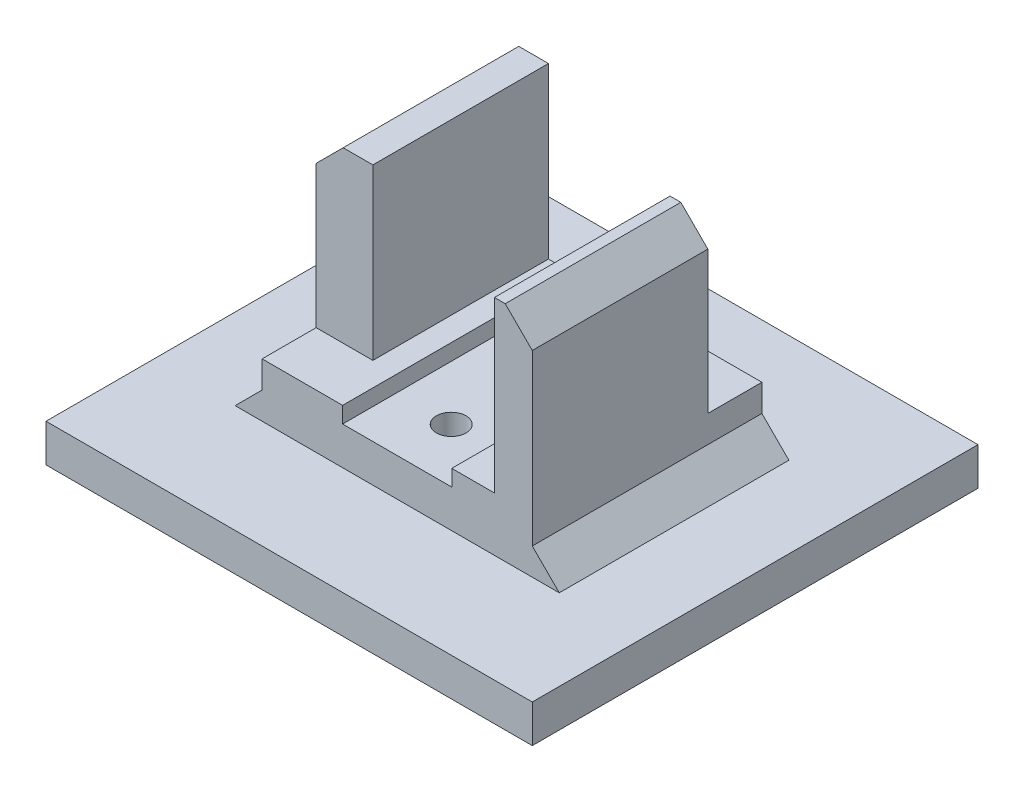
ISO-10303-21;
HEADER;
FILE_DESCRIPTION(('STEP AP214'),'2;1');
FILE_NAME('part.step','',(''),(''),'','','');
FILE_SCHEMA(('AUTOMOTIVE_DESIGN { 1 0 10303 214 1 1 1 1 }'));
ENDSEC;
DATA;
#1=APPLICATION_CONTEXT('core data for automotive mechanical design processes');
#2=APPLICATION_PROTOCOL_DEFINITION('international standard','automotive_design',2000,#1);
#3=PRODUCT_CONTEXT('',#1,'mechanical');
#4=PRODUCT('Part','Part','',(#3));
#5=PRODUCT_RELATED_PRODUCT_CATEGORY('part','',(#4));
#6=PRODUCT_DEFINITION_FORMATION('','',#4);
#7=PRODUCT_DEFINITION_CONTEXT('part definition',#1,'design');
#8=PRODUCT_DEFINITION('design','',#6,#7);
#9=PRODUCT_DEFINITION_SHAPE('','',#8);
#10=(LENGTH_UNIT() NAMED_UNIT(*) SI_UNIT(.MILLI.,.METRE.));
#11=(NAMED_UNIT(*) PLANE_ANGLE_UNIT() SI_UNIT($,.RADIAN.));
#12=(NAMED_UNIT(*) SI_UNIT($,.STERADIAN.) SOLID_ANGLE_UNIT());
#13=UNCERTAINTY_MEASURE_WITH_UNIT(LENGTH_MEASURE(1.E-05),#10,'distance_accuracy_value','');
#14=(GEOMETRIC_REPRESENTATION_CONTEXT(3) GLOBAL_UNCERTAINTY_ASSIGNED_CONTEXT((#13)) GLOBAL_UNIT_ASSIGNED_CONTEXT((#10,
#11,#12)) REPRESENTATION_CONTEXT('',''));
#15=CARTESIAN_POINT('',(0.,0.,0.));
#16=DIRECTION('',(0.,0.,1.));
#17=DIRECTION('',(1.,0.,0.));
#18=AXIS2_PLACEMENT_3D('',#15,#16,#17);
#19=CARTESIAN_POINT('',(50.,-19.2478049012123,25.574084419921));
#20=DIRECTION('',(0.,-1.,0.));
#21=DIRECTION('',(0.,0.,-1.));
#22=AXIS2_PLACEMENT_3D('',#19,#20,#21);
#23=PLANE('',#22);
#24=CARTESIAN_POINT('',(25.,-19.2478049012123,36.074084419921));
#25=DIRECTION('',(0.,1.,0.));
#26=DIRECTION('',(0.,0.,1.));
#27=AXIS2_PLACEMENT_3D('',#24,#25,#26);
#28=CIRCLE('',#27,2.75);
#29=CARTESIAN_POINT('',(25.,-19.2478049012123,38.824084419921));
#30=VERTEX_POINT('',#29);
#31=EDGE_CURVE('E353',#30,#30,#28,.T.);
#32=ORIENTED_EDGE('',*,*,#31,.F.);
#33=EDGE_LOOP('',(#32));
#34=FACE_BOUND('',#33,.T.);
#35=CARTESIAN_POINT('',(25.,-19.2478049012123,58.074084419921));
#36=DIRECTION('',(0.,1.,0.));
#37=DIRECTION('',(0.,0.,1.));
#38=AXIS2_PLACEMENT_3D('',#35,#36,#37);
#39=CIRCLE('',#38,2.75);
#40=CARTESIAN_POINT('',(25.,-19.2478049012123,60.824084419921));
#41=VERTEX_POINT('',#40);
#42=EDGE_CURVE('E348',#41,#41,#39,.T.);
#43=ORIENTED_EDGE('',*,*,#42,.F.);
#44=EDGE_LOOP('',(#43));
#45=FACE_BOUND('',#44,.T.);
#46=DIRECTION('',(0.,0.,-1.));
#47=VECTOR('',#46,1.);
#48=CARTESIAN_POINT('',(14.9,-19.2478049012123,68.074084419921));
#49=LINE('',#48,#47);
#50=CARTESIAN_POINT('',(14.9,-19.2478049012123,68.074084419921));
#51=VERTEX_POINT('',#50);
#52=CARTESIAN_POINT('',(14.9,-19.2478049012123,25.574084419921));
#53=VERTEX_POINT('',#52);
#54=EDGE_CURVE('E312',#51,#53,#49,.T.);
#55=ORIENTED_EDGE('',*,*,#54,.F.);
#56=DIRECTION('',(-1.,0.,0.));
#57=VECTOR('',#56,1.);
#58=CARTESIAN_POINT('',(50.,-19.2478049012123,68.074084419921));
#59=LINE('',#58,#57);
#60=CARTESIAN_POINT('',(35.1,-19.2478049012123,68.074084419921));
#61=VERTEX_POINT('',#60);
#62=EDGE_CURVE('E244',#61,#51,#59,.T.);
#63=ORIENTED_EDGE('',*,*,#62,.F.);
#64=DIRECTION('',(0.,0.,1.));
#65=VECTOR('',#64,1.);
#66=CARTESIAN_POINT('',(35.1,-19.2478049012123,68.074084419921));
#67=LINE('',#66,#65);
#68=CARTESIAN_POINT('',(35.1,-19.2478049012123,25.574084419921));
#69=VERTEX_POINT('',#68);
#70=EDGE_CURVE('E330',#69,#61,#67,.T.);
#71=ORIENTED_EDGE('',*,*,#70,.F.);
#72=DIRECTION('',(-1.,0.,0.));
#73=VECTOR('',#72,1.);
#74=CARTESIAN_POINT('',(50.,-19.2478049012123,25.574084419921));
#75=LINE('',#74,#73);
#76=EDGE_CURVE('E249',#69,#53,#75,.T.);
#77=ORIENTED_EDGE('',*,*,#76,.T.);
#78=EDGE_LOOP('',(#55,#63,#71,#77));
#79=FACE_BOUND('',#78,.T.);
#80=ADVANCED_FACE('F32',(#34,#45,#79),#23,.F.);
#81=CARTESIAN_POINT('',(10.5,-19.2478049012123,-10.3365153371065));
#82=DIRECTION('',(1.,0.,0.));
#83=DIRECTION('',(0.,1.,0.));
#84=AXIS2_PLACEMENT_3D('',#81,#82,#83);
#85=PLANE('',#84);
#86=DIRECTION('',(0.,1.,0.));
#87=VECTOR('',#86,1.);
#88=CARTESIAN_POINT('',(10.5,-27.6605171117256,58.074084419921));
#89=LINE('',#88,#87);
#90=CARTESIAN_POINT('',(10.5,-16.2478049012123,58.074084419921));
#91=VERTEX_POINT('',#90);
#92=CARTESIAN_POINT('',(10.5,15.0934410707879,58.074084419921));
#93=VERTEX_POINT('',#92);
#94=EDGE_CURVE('E309',#91,#93,#89,.T.);
#95=ORIENTED_EDGE('',*,*,#94,.F.);
#96=DIRECTION('',(0.,0.,1.));
#97=VECTOR('',#96,1.);
#98=CARTESIAN_POINT('',(10.5,-16.2478049012123,68.074084419921));
#99=LINE('',#98,#97);
#100=CARTESIAN_POINT('',(10.5,-16.2478049012123,25.574084419921));
#101=VERTEX_POINT('',#100);
#102=EDGE_CURVE('E308',#101,#91,#99,.T.);
#103=ORIENTED_EDGE('',*,*,#102,.F.);
#104=DIRECTION('',(0.,-1.,0.));
#105=VECTOR('',#104,1.);
#106=CARTESIAN_POINT('',(10.5,-19.2478049012123,25.574084419921));
#107=LINE('',#106,#105);
#108=CARTESIAN_POINT('',(10.5,15.0934410707879,25.574084419921));
#109=VERTEX_POINT('',#108);
#110=EDGE_CURVE('E205',#109,#101,#107,.T.);
#111=ORIENTED_EDGE('',*,*,#110,.F.);
#112=DIRECTION('',(0.,0.,1.));
#113=VECTOR('',#112,1.);
#114=CARTESIAN_POINT('',(10.5,15.0934410707879,-10.3365153371065));
#115=LINE('',#114,#113);
#116=EDGE_CURVE('E202',#109,#93,#115,.T.);
#117=ORIENTED_EDGE('',*,*,#116,.T.);
#118=EDGE_LOOP('',(#95,#103,#111,#117));
#119=FACE_BOUND('',#118,.T.);
#120=ADVANCED_FACE('F306',(#119),#85,.T.);
#121=CARTESIAN_POINT('',(50.,-19.2478049012123,25.574084419921));
#122=DIRECTION('',(0.,0.,1.));
#123=DIRECTION('',(1.,0.,0.));
#124=AXIS2_PLACEMENT_3D('',#121,#122,#123);
#125=PLANE('',#124);
#126=DIRECTION('',(-1.,0.,0.));
#127=VECTOR('',#126,1.);
#128=CARTESIAN_POINT('',(43.,-16.2478049012123,25.574084419921));
#129=LINE('',#128,#127);
#130=CARTESIAN_POINT('',(50.,-16.2478049012123,25.574084419921));
#131=VERTEX_POINT('',#130);
#132=CARTESIAN_POINT('',(35.1,-16.2478049012123,25.574084419921));
#133=VERTEX_POINT('',#132);
#134=EDGE_CURVE('E333',#131,#133,#129,.T.);
#135=ORIENTED_EDGE('',*,*,#134,.F.);
#136=DIRECTION('',(0.,1.,0.));
#137=VECTOR('',#136,1.);
#138=CARTESIAN_POINT('',(50.,-19.2478049012123,25.574084419921));
#139=LINE('',#138,#137);
#140=CARTESIAN_POINT('',(50.,-21.2478049012123,25.574084419921));
#141=VERTEX_POINT('',#140);
#142=EDGE_CURVE('E238',#141,#131,#139,.T.);
#143=ORIENTED_EDGE('',*,*,#142,.F.);
#144=DIRECTION('',(-0.707106781186552,0.707106781186543,0.));
#145=VECTOR('',#144,1.);
#146=CARTESIAN_POINT('',(49.,-20.2478049012123,25.574084419921));
#147=LINE('',#146,#145);
#148=CARTESIAN_POINT('',(55.0000000000001,-26.2478049012123,25.574084419921));
#149=VERTEX_POINT('',#148);
#150=EDGE_CURVE('E271',#141,#149,#147,.F.);
#151=ORIENTED_EDGE('',*,*,#150,.T.);
#152=DIRECTION('',(1.,0.,0.));
#153=VECTOR('',#152,1.);
#154=CARTESIAN_POINT('',(50.,-26.2478049012123,25.574084419921));
#155=LINE('',#154,#153);
#156=CARTESIAN_POINT('',(-5.00000000000003,-26.2478049012123,25.574084419921));
#157=VERTEX_POINT('',#156);
#158=EDGE_CURVE('E225',#157,#149,#155,.T.);
#159=ORIENTED_EDGE('',*,*,#158,.F.);
#160=DIRECTION('',(0.707106781186551,0.707106781186544,0.));
#161=VECTOR('',#160,1.);
#162=CARTESIAN_POINT('',(26.0000000000003,4.75219509878769,25.574084419921));
#163=LINE('',#162,#161);
#164=CARTESIAN_POINT('',(0.,-21.2478049012123,25.574084419921));
#165=VERTEX_POINT('',#164);
#166=EDGE_CURVE('E263',#157,#165,#163,.T.);
#167=ORIENTED_EDGE('',*,*,#166,.T.);
#168=DIRECTION('',(0.,1.,0.));
#169=VECTOR('',#168,1.);
#170=CARTESIAN_POINT('',(0.,-19.2478049012123,25.574084419921));
#171=LINE('',#170,#169);
#172=CARTESIAN_POINT('',(0.,10.0934410707879,25.574084419921));
#173=VERTEX_POINT('',#172);
#174=EDGE_CURVE('E237',#165,#173,#171,.T.);
#175=ORIENTED_EDGE('',*,*,#174,.T.);
#176=DIRECTION('',(-0.707106781186547,-0.707106781186549,0.));
#177=VECTOR('',#176,1.);
#178=CARTESIAN_POINT('',(4.99999999999999,15.0934410707879,25.574084419921));
#179=LINE('',#178,#177);
#180=CARTESIAN_POINT('',(4.99999999999999,15.0934410707879,25.574084419921));
#181=VERTEX_POINT('',#180);
#182=EDGE_CURVE('E54',#173,#181,#179,.F.);
#183=ORIENTED_EDGE('',*,*,#182,.T.);
#184=DIRECTION('',(1.,0.,0.));
#185=VECTOR('',#184,1.);
#186=CARTESIAN_POINT('',(10.5,15.0934410707879,25.574084419921));
#187=LINE('',#186,#185);
#188=EDGE_CURVE('E212',#181,#109,#187,.T.);
#189=ORIENTED_EDGE('',*,*,#188,.T.);
#190=ORIENTED_EDGE('',*,*,#110,.T.);
#191=DIRECTION('',(-1.,0.,0.));
#192=VECTOR('',#191,1.);
#193=CARTESIAN_POINT('',(10.5,-16.2478049012123,25.574084419921));
#194=LINE('',#193,#192);
#195=CARTESIAN_POINT('',(14.9,-16.2478049012123,25.574084419921));
#196=VERTEX_POINT('',#195);
#197=EDGE_CURVE('E323',#196,#101,#194,.T.);
#198=ORIENTED_EDGE('',*,*,#197,.F.);
#199=DIRECTION('',(0.,-1.,0.));
#200=VECTOR('',#199,1.);
#201=CARTESIAN_POINT('',(14.9,-16.2478049012123,25.574084419921));
#202=LINE('',#201,#200);
#203=EDGE_CURVE('E324',#196,#53,#202,.T.);
#204=ORIENTED_EDGE('',*,*,#203,.T.);
#205=ORIENTED_EDGE('',*,*,#76,.F.);
#206=DIRECTION('',(0.,-1.,0.));
#207=VECTOR('',#206,1.);
#208=CARTESIAN_POINT('',(35.1,-16.2478049012123,25.574084419921));
#209=LINE('',#208,#207);
#210=EDGE_CURVE('E345',#133,#69,#209,.T.);
#211=ORIENTED_EDGE('',*,*,#210,.F.);
#212=EDGE_LOOP('',(#135,#143,#151,#159,#167,#175,#183,#189,#190,#198,#204,#205,#211));
#213=FACE_BOUND('',#212,.T.);
#214=ADVANCED_FACE('F292',(#213),#125,.F.);
#215=CARTESIAN_POINT('',(50.,-19.2478049012123,68.074084419921));
#216=DIRECTION('',(0.,0.,-1.));
#217=DIRECTION('',(-1.,0.,0.));
#218=AXIS2_PLACEMENT_3D('',#215,#216,#217);
#219=PLANE('',#218);
#220=DIRECTION('',(1.,0.,0.));
#221=VECTOR('',#220,1.);
#222=CARTESIAN_POINT('',(10.5,-16.2478049012123,68.074084419921));
#223=LINE('',#222,#221);
#224=CARTESIAN_POINT('',(0.,-16.2478049012123,68.074084419921));
#225=VERTEX_POINT('',#224);
#226=CARTESIAN_POINT('',(14.9,-16.2478049012123,68.074084419921));
#227=VERTEX_POINT('',#226);
#228=EDGE_CURVE('E311',#225,#227,#223,.T.);
#229=ORIENTED_EDGE('',*,*,#228,.F.);
#230=DIRECTION('',(0.,-1.,0.));
#231=VECTOR('',#230,1.);
#232=CARTESIAN_POINT('',(0.,-19.2478049012123,68.074084419921));
#233=LINE('',#232,#231);
#234=CARTESIAN_POINT('',(0.,-21.2478049012123,68.074084419921));
#235=VERTEX_POINT('',#234);
#236=EDGE_CURVE('E242',#225,#235,#233,.T.);
#237=ORIENTED_EDGE('',*,*,#236,.T.);
#238=DIRECTION('',(-0.707106781186551,-0.707106781186544,0.));
#239=VECTOR('',#238,1.);
#240=CARTESIAN_POINT('',(26.0000000000003,4.75219509878769,68.074084419921));
#241=LINE('',#240,#239);
#242=CARTESIAN_POINT('',(-5.00000000000003,-26.2478049012123,68.074084419921));
#243=VERTEX_POINT('',#242);
#244=EDGE_CURVE('E265',#235,#243,#241,.T.);
#245=ORIENTED_EDGE('',*,*,#244,.T.);
#246=DIRECTION('',(-1.,0.,0.));
#247=VECTOR('',#246,1.);
#248=CARTESIAN_POINT('',(50.,-26.2478049012123,68.074084419921));
#249=LINE('',#248,#247);
#250=CARTESIAN_POINT('',(55.0000000000001,-26.2478049012123,68.074084419921));
#251=VERTEX_POINT('',#250);
#252=EDGE_CURVE('E223',#251,#243,#249,.T.);
#253=ORIENTED_EDGE('',*,*,#252,.F.);
#254=DIRECTION('',(0.707106781186552,-0.707106781186543,0.));
#255=VECTOR('',#254,1.);
#256=CARTESIAN_POINT('',(49.,-20.2478049012123,68.074084419921));
#257=LINE('',#256,#255);
#258=CARTESIAN_POINT('',(50.,-21.2478049012123,68.074084419921));
#259=VERTEX_POINT('',#258);
#260=EDGE_CURVE('E268',#251,#259,#257,.F.);
#261=ORIENTED_EDGE('',*,*,#260,.T.);
#262=DIRECTION('',(0.,-1.,0.));
#263=VECTOR('',#262,1.);
#264=CARTESIAN_POINT('',(50.,-19.2478049012123,68.074084419921));
#265=LINE('',#264,#263);
#266=CARTESIAN_POINT('',(50.,10.0934410707879,68.074084419921));
#267=VERTEX_POINT('',#266);
#268=EDGE_CURVE('E241',#267,#259,#265,.T.);
#269=ORIENTED_EDGE('',*,*,#268,.F.);
#270=DIRECTION('',(-0.707106781186549,0.707106781186547,0.));
#271=VECTOR('',#270,1.);
#272=CARTESIAN_POINT('',(50.,10.0934410707879,68.074084419921));
#273=LINE('',#272,#271);
#274=CARTESIAN_POINT('',(45.,15.0934410707879,68.074084419921));
#275=VERTEX_POINT('',#274);
#276=EDGE_CURVE('E276',#267,#275,#273,.T.);
#277=ORIENTED_EDGE('',*,*,#276,.T.);
#278=DIRECTION('',(-1.,0.,0.));
#279=VECTOR('',#278,1.);
#280=CARTESIAN_POINT('',(50.,15.0934410707879,68.074084419921));
#281=LINE('',#280,#279);
#282=CARTESIAN_POINT('',(43.,15.0934410707879,68.074084419921));
#283=VERTEX_POINT('',#282);
#284=EDGE_CURVE('E207',#275,#283,#281,.T.);
#285=ORIENTED_EDGE('',*,*,#284,.T.);
#286=DIRECTION('',(0.,-1.,0.));
#287=VECTOR('',#286,1.);
#288=CARTESIAN_POINT('',(43.,-19.2478049012123,68.074084419921));
#289=LINE('',#288,#287);
#290=CARTESIAN_POINT('',(43.,-16.2478049012123,68.074084419921));
#291=VERTEX_POINT('',#290);
#292=EDGE_CURVE('E201',#283,#291,#289,.T.);
#293=ORIENTED_EDGE('',*,*,#292,.T.);
#294=DIRECTION('',(1.,0.,0.));
#295=VECTOR('',#294,1.);
#296=CARTESIAN_POINT('',(43.,-16.2478049012123,68.074084419921));
#297=LINE('',#296,#295);
#298=CARTESIAN_POINT('',(35.1,-16.2478049012123,68.074084419921));
#299=VERTEX_POINT('',#298);
#300=EDGE_CURVE('E337',#299,#291,#297,.T.);
#301=ORIENTED_EDGE('',*,*,#300,.F.);
#302=DIRECTION('',(0.,-1.,0.));
#303=VECTOR('',#302,1.);
#304=CARTESIAN_POINT('',(35.1,-16.2478049012123,68.074084419921));
#305=LINE('',#304,#303);
#306=EDGE_CURVE('E340',#299,#61,#305,.T.);
#307=ORIENTED_EDGE('',*,*,#306,.T.);
#308=ORIENTED_EDGE('',*,*,#62,.T.);
#309=DIRECTION('',(0.,-1.,0.));
#310=VECTOR('',#309,1.);
#311=CARTESIAN_POINT('',(14.9,-16.2478049012123,68.074084419921));
#312=LINE('',#311,#310);
#313=EDGE_CURVE('E328',#227,#51,#312,.T.);
#314=ORIENTED_EDGE('',*,*,#313,.F.);
#315=EDGE_LOOP('',(#229,#237,#245,#253,#261,#269,#277,#285,#293,#301,#307,#308,#314));
#316=FACE_BOUND('',#315,.T.);
#317=ADVANCED_FACE('F372',(#316),#219,.F.);
#318=CARTESIAN_POINT('',(50.,0.,0.));
#319=DIRECTION('',(-1.,0.,0.));
#320=DIRECTION('',(0.,0.,1.));
#321=AXIS2_PLACEMENT_3D('',#318,#319,#320);
#322=PLANE('',#321);
#323=ORIENTED_EDGE('',*,*,#142,.T.);
#324=DIRECTION('',(0.,0.,-1.));
#325=VECTOR('',#324,1.);
#326=CARTESIAN_POINT('',(50.,-16.2478049012123,25.574084419921));
#327=LINE('',#326,#325);
#328=CARTESIAN_POINT('',(50.,-16.2478049012123,35.574084419921));
#329=VERTEX_POINT('',#328);
#330=EDGE_CURVE('E384',#329,#131,#327,.T.);
#331=ORIENTED_EDGE('',*,*,#330,.F.);
#332=DIRECTION('',(0.,1.,0.));
#333=VECTOR('',#332,1.);
#334=CARTESIAN_POINT('',(50.,-27.6605171117256,35.574084419921));
#335=LINE('',#334,#333);
#336=CARTESIAN_POINT('',(50.,10.0934410707879,35.574084419921));
#337=VERTEX_POINT('',#336);
#338=EDGE_CURVE('E319',#329,#337,#335,.T.);
#339=ORIENTED_EDGE('',*,*,#338,.T.);
#340=DIRECTION('',(0.,0.,1.));
#341=VECTOR('',#340,1.);
#342=CARTESIAN_POINT('',(50.,10.0934410707879,68.074084419921));
#343=LINE('',#342,#341);
#344=EDGE_CURVE('E274',#337,#267,#343,.T.);
#345=ORIENTED_EDGE('',*,*,#344,.T.);
#346=ORIENTED_EDGE('',*,*,#268,.T.);
#347=DIRECTION('',(0.,0.,-1.));
#348=VECTOR('',#347,1.);
#349=CARTESIAN_POINT('',(50.,-21.2478049012123,25.574084419921));
#350=LINE('',#349,#348);
#351=EDGE_CURVE('E261',#259,#141,#350,.T.);
#352=ORIENTED_EDGE('',*,*,#351,.T.);
#353=EDGE_LOOP('',(#323,#331,#339,#345,#346,#352));
#354=FACE_BOUND('',#353,.T.);
#355=ADVANCED_FACE('F382',(#354),#322,.F.);
#356=CARTESIAN_POINT('',(0.,0.,0.));
#357=DIRECTION('',(-1.,0.,0.));
#358=DIRECTION('',(0.,0.,1.));
#359=AXIS2_PLACEMENT_3D('',#356,#357,#358);
#360=PLANE('',#359);
#361=DIRECTION('',(0.,0.,1.));
#362=VECTOR('',#361,1.);
#363=CARTESIAN_POINT('',(0.,-16.2478049012123,68.074084419921));
#364=LINE('',#363,#362);
#365=CARTESIAN_POINT('',(0.,-16.2478049012123,58.074084419921));
#366=VERTEX_POINT('',#365);
#367=EDGE_CURVE('E196',#366,#225,#364,.T.);
#368=ORIENTED_EDGE('',*,*,#367,.F.);
#369=DIRECTION('',(0.,1.,0.));
#370=VECTOR('',#369,1.);
#371=CARTESIAN_POINT('',(0.,-27.4281447887112,58.074084419921));
#372=LINE('',#371,#370);
#373=CARTESIAN_POINT('',(0.,10.0934410707879,58.074084419921));
#374=VERTEX_POINT('',#373);
#375=EDGE_CURVE('E290',#366,#374,#372,.T.);
#376=ORIENTED_EDGE('',*,*,#375,.T.);
#377=DIRECTION('',(0.,0.,-1.));
#378=VECTOR('',#377,1.);
#379=CARTESIAN_POINT('',(0.,10.0934410707879,0.));
#380=LINE('',#379,#378);
#381=EDGE_CURVE('E40',#374,#173,#380,.T.);
#382=ORIENTED_EDGE('',*,*,#381,.T.);
#383=ORIENTED_EDGE('',*,*,#174,.F.);
#384=DIRECTION('',(0.,0.,1.));
#385=VECTOR('',#384,1.);
#386=CARTESIAN_POINT('',(0.,-21.2478049012123,0.));
#387=LINE('',#386,#385);
#388=EDGE_CURVE('E258',#165,#235,#387,.T.);
#389=ORIENTED_EDGE('',*,*,#388,.T.);
#390=ORIENTED_EDGE('',*,*,#236,.F.);
#391=EDGE_LOOP('',(#368,#376,#382,#383,#389,#390));
#392=FACE_BOUND('',#391,.T.);
#393=ADVANCED_FACE('F287',(#392),#360,.T.);
#394=CARTESIAN_POINT('',(-20.,-30.2478049012123,5.57408441992097));
#395=DIRECTION('',(0.,0.,1.));
#396=DIRECTION('',(1.,0.,0.));
#397=AXIS2_PLACEMENT_3D('',#394,#395,#396);
#398=PLANE('',#397);
#399=DIRECTION('',(1.,0.,0.));
#400=VECTOR('',#399,1.);
#401=CARTESIAN_POINT('',(-20.,-26.2478049012123,5.57408441992097));
#402=LINE('',#401,#400);
#403=CARTESIAN_POINT('',(-20.,-26.2478049012123,5.57408441992097));
#404=VERTEX_POINT('',#403);
#405=CARTESIAN_POINT('',(70.,-26.2478049012123,5.57408441992097));
#406=VERTEX_POINT('',#405);
#407=EDGE_CURVE('E233',#404,#406,#402,.T.);
#408=ORIENTED_EDGE('',*,*,#407,.T.);
#409=DIRECTION('',(0.,1.,0.));
#410=VECTOR('',#409,1.);
#411=CARTESIAN_POINT('',(70.,-30.2478049012123,5.57408441992097));
#412=LINE('',#411,#410);
#413=CARTESIAN_POINT('',(70.,-33.2478049012123,5.57408441992097));
#414=VERTEX_POINT('',#413);
#415=EDGE_CURVE('E217',#414,#406,#412,.T.);
#416=ORIENTED_EDGE('',*,*,#415,.F.);
#417=DIRECTION('',(1.,0.,0.));
#418=VECTOR('',#417,1.);
#419=CARTESIAN_POINT('',(-20.,-33.2478049012123,5.57408441992097));
#420=LINE('',#419,#418);
#421=CARTESIAN_POINT('',(-20.,-33.2478049012123,5.57408441992097));
#422=VERTEX_POINT('',#421);
#423=EDGE_CURVE('E363',#422,#414,#420,.T.);
#424=ORIENTED_EDGE('',*,*,#423,.F.);
#425=DIRECTION('',(0.,-1.,0.));
#426=VECTOR('',#425,1.);
#427=CARTESIAN_POINT('',(-20.,-30.2478049012123,5.57408441992097));
#428=LINE('',#427,#426);
#429=EDGE_CURVE('E227',#404,#422,#428,.T.);
#430=ORIENTED_EDGE('',*,*,#429,.F.);
#431=EDGE_LOOP('',(#408,#416,#424,#430));
#432=FACE_BOUND('',#431,.T.);
#433=ADVANCED_FACE('F459',(#432),#398,.F.);
#434=CARTESIAN_POINT('',(-20.,-30.2478049012123,88.074084419921));
#435=DIRECTION('',(0.,0.,-1.));
#436=DIRECTION('',(-1.,0.,0.));
#437=AXIS2_PLACEMENT_3D('',#434,#435,#436);
#438=PLANE('',#437);
#439=DIRECTION('',(0.,1.,0.));
#440=VECTOR('',#439,1.);
#441=CARTESIAN_POINT('',(-20.,-30.2478049012123,88.074084419921));
#442=LINE('',#441,#440);
#443=CARTESIAN_POINT('',(-20.,-33.2478049012123,88.074084419921));
#444=VERTEX_POINT('',#443);
#445=CARTESIAN_POINT('',(-20.,-26.2478049012123,88.074084419921));
#446=VERTEX_POINT('',#445);
#447=EDGE_CURVE('E229',#444,#446,#442,.T.);
#448=ORIENTED_EDGE('',*,*,#447,.F.);
#449=DIRECTION('',(-1.,0.,0.));
#450=VECTOR('',#449,1.);
#451=CARTESIAN_POINT('',(-20.,-33.2478049012123,88.074084419921));
#452=LINE('',#451,#450);
#453=CARTESIAN_POINT('',(70.,-33.2478049012123,88.074084419921));
#454=VERTEX_POINT('',#453);
#455=EDGE_CURVE('E369',#454,#444,#452,.T.);
#456=ORIENTED_EDGE('',*,*,#455,.F.);
#457=DIRECTION('',(0.,-1.,0.));
#458=VECTOR('',#457,1.);
#459=CARTESIAN_POINT('',(70.,-30.2478049012123,88.074084419921));
#460=LINE('',#459,#458);
#461=CARTESIAN_POINT('',(70.,-26.2478049012123,88.074084419921));
#462=VERTEX_POINT('',#461);
#463=EDGE_CURVE('E215',#462,#454,#460,.T.);
#464=ORIENTED_EDGE('',*,*,#463,.F.);
#465=DIRECTION('',(1.,0.,0.));
#466=VECTOR('',#465,1.);
#467=CARTESIAN_POINT('',(-20.,-26.2478049012123,88.074084419921));
#468=LINE('',#467,#466);
#469=EDGE_CURVE('E235',#446,#462,#468,.T.);
#470=ORIENTED_EDGE('',*,*,#469,.F.);
#471=EDGE_LOOP('',(#448,#456,#464,#470));
#472=FACE_BOUND('',#471,.T.);
#473=ADVANCED_FACE('F463',(#472),#438,.F.);
#474=CARTESIAN_POINT('',(-20.,-26.2478049012123,5.57408441992097));
#475=DIRECTION('',(0.,-1.,0.));
#476=DIRECTION('',(0.,0.,-1.));
#477=AXIS2_PLACEMENT_3D('',#474,#475,#476);
#478=PLANE('',#477);
#479=DIRECTION('',(0.,0.,-1.));
#480=VECTOR('',#479,1.);
#481=CARTESIAN_POINT('',(-5.00000000000003,-26.2478049012123,5.57408441992097));
#482=LINE('',#481,#480);
#483=EDGE_CURVE('E255',#243,#157,#482,.T.);
#484=ORIENTED_EDGE('',*,*,#483,.T.);
#485=ORIENTED_EDGE('',*,*,#158,.T.);
#486=DIRECTION('',(0.,0.,1.));
#487=VECTOR('',#486,1.);
#488=CARTESIAN_POINT('',(55.0000000000001,-26.2478049012123,68.074084419921));
#489=LINE('',#488,#487);
#490=EDGE_CURVE('E252',#149,#251,#489,.T.);
#491=ORIENTED_EDGE('',*,*,#490,.T.);
#492=ORIENTED_EDGE('',*,*,#252,.T.);
#493=EDGE_LOOP('',(#484,#485,#491,#492));
#494=FACE_BOUND('',#493,.T.);
#495=ORIENTED_EDGE('',*,*,#469,.T.);
#496=DIRECTION('',(0.,0.,1.));
#497=VECTOR('',#496,1.);
#498=CARTESIAN_POINT('',(70.,-26.2478049012123,88.074084419921));
#499=LINE('',#498,#497);
#500=EDGE_CURVE('E220',#406,#462,#499,.T.);
#501=ORIENTED_EDGE('',*,*,#500,.F.);
#502=ORIENTED_EDGE('',*,*,#407,.F.);
#503=DIRECTION('',(0.,0.,-1.));
#504=VECTOR('',#503,1.);
#505=CARTESIAN_POINT('',(-20.,-26.2478049012123,5.57408441992097));
#506=LINE('',#505,#504);
#507=EDGE_CURVE('E231',#446,#404,#506,.T.);
#508=ORIENTED_EDGE('',*,*,#507,.F.);
#509=EDGE_LOOP('',(#495,#501,#502,#508));
#510=FACE_BOUND('',#509,.T.);
#511=ADVANCED_FACE('F420',(#494,#510),#478,.F.);
#512=CARTESIAN_POINT('',(-20.,0.,0.));
#513=DIRECTION('',(1.,0.,0.));
#514=DIRECTION('',(0.,0.,-1.));
#515=AXIS2_PLACEMENT_3D('',#512,#513,#514);
#516=PLANE('',#515);
#517=ORIENTED_EDGE('',*,*,#429,.T.);
#518=DIRECTION('',(0.,0.,-1.));
#519=VECTOR('',#518,1.);
#520=CARTESIAN_POINT('',(-20.,-33.2478049012123,5.57408441992097));
#521=LINE('',#520,#519);
#522=EDGE_CURVE('E352',#444,#422,#521,.T.);
#523=ORIENTED_EDGE('',*,*,#522,.F.);
#524=ORIENTED_EDGE('',*,*,#447,.T.);
#525=ORIENTED_EDGE('',*,*,#507,.T.);
#526=EDGE_LOOP('',(#517,#523,#524,#525));
#527=FACE_BOUND('',#526,.T.);
#528=ADVANCED_FACE('F470',(#527),#516,.F.);
#529=CARTESIAN_POINT('',(70.,0.,0.));
#530=DIRECTION('',(-1.,0.,0.));
#531=DIRECTION('',(0.,0.,1.));
#532=AXIS2_PLACEMENT_3D('',#529,#530,#531);
#533=PLANE('',#532);
#534=ORIENTED_EDGE('',*,*,#463,.T.);
#535=DIRECTION('',(0.,0.,1.));
#536=VECTOR('',#535,1.);
#537=CARTESIAN_POINT('',(70.,-33.2478049012123,5.57408441992097));
#538=LINE('',#537,#536);
#539=EDGE_CURVE('E366',#414,#454,#538,.T.);
#540=ORIENTED_EDGE('',*,*,#539,.F.);
#541=ORIENTED_EDGE('',*,*,#415,.T.);
#542=ORIENTED_EDGE('',*,*,#500,.T.);
#543=EDGE_LOOP('',(#534,#540,#541,#542));
#544=FACE_BOUND('',#543,.T.);
#545=ADVANCED_FACE('F473',(#544),#533,.F.);
#546=CARTESIAN_POINT('',(10.5,15.0934410707879,-10.3365153371065));
#547=DIRECTION('',(0.,1.,0.));
#548=DIRECTION('',(0.,0.,1.));
#549=AXIS2_PLACEMENT_3D('',#546,#547,#548);
#550=PLANE('',#549);
#551=DIRECTION('',(-1.,0.,0.));
#552=VECTOR('',#551,1.);
#553=CARTESIAN_POINT('',(4.99999999999999,15.0934410707879,58.074084419921));
#554=LINE('',#553,#552);
#555=CARTESIAN_POINT('',(4.99999999999999,15.0934410707879,58.074084419921));
#556=VERTEX_POINT('',#555);
#557=EDGE_CURVE('E300',#93,#556,#554,.T.);
#558=ORIENTED_EDGE('',*,*,#557,.F.);
#559=ORIENTED_EDGE('',*,*,#116,.F.);
#560=ORIENTED_EDGE('',*,*,#188,.F.);
#561=DIRECTION('',(0.,0.,1.));
#562=VECTOR('',#561,1.);
#563=CARTESIAN_POINT('',(4.99999999999999,15.0934410707879,-10.3365153371065));
#564=LINE('',#563,#562);
#565=EDGE_CURVE('E280',#181,#556,#564,.T.);
#566=ORIENTED_EDGE('',*,*,#565,.T.);
#567=EDGE_LOOP('',(#558,#559,#560,#566));
#568=FACE_BOUND('',#567,.T.);
#569=ADVANCED_FACE('F298',(#568),#550,.T.);
#570=CARTESIAN_POINT('',(43.,-19.2478049012123,-10.3365153371065));
#571=DIRECTION('',(-1.,0.,0.));
#572=DIRECTION('',(0.,0.,1.));
#573=AXIS2_PLACEMENT_3D('',#570,#571,#572);
#574=PLANE('',#573);
#575=DIRECTION('',(0.,1.,0.));
#576=VECTOR('',#575,1.);
#577=CARTESIAN_POINT('',(43.,-27.4281447887112,35.574084419921));
#578=LINE('',#577,#576);
#579=CARTESIAN_POINT('',(43.,-16.2478049012123,35.574084419921));
#580=VERTEX_POINT('',#579);
#581=CARTESIAN_POINT('',(43.,15.0934410707879,35.574084419921));
#582=VERTEX_POINT('',#581);
#583=EDGE_CURVE('E179',#580,#582,#578,.T.);
#584=ORIENTED_EDGE('',*,*,#583,.F.);
#585=DIRECTION('',(0.,0.,-1.));
#586=VECTOR('',#585,1.);
#587=CARTESIAN_POINT('',(43.,-16.2478049012123,68.074084419921));
#588=LINE('',#587,#586);
#589=EDGE_CURVE('E331',#291,#580,#588,.T.);
#590=ORIENTED_EDGE('',*,*,#589,.F.);
#591=ORIENTED_EDGE('',*,*,#292,.F.);
#592=DIRECTION('',(0.,0.,1.));
#593=VECTOR('',#592,1.);
#594=CARTESIAN_POINT('',(43.,15.0934410707879,-10.3365153371065));
#595=LINE('',#594,#593);
#596=EDGE_CURVE('E192',#582,#283,#595,.T.);
#597=ORIENTED_EDGE('',*,*,#596,.F.);
#598=EDGE_LOOP('',(#584,#590,#591,#597));
#599=FACE_BOUND('',#598,.T.);
#600=ADVANCED_FACE('F199',(#599),#574,.T.);
#601=CARTESIAN_POINT('',(50.,15.0934410707879,-10.3365153371065));
#602=DIRECTION('',(0.,1.,0.));
#603=DIRECTION('',(0.,0.,1.));
#604=AXIS2_PLACEMENT_3D('',#601,#602,#603);
#605=PLANE('',#604);
#606=DIRECTION('',(1.,0.,0.));
#607=VECTOR('',#606,1.);
#608=CARTESIAN_POINT('',(45.,15.0934410707879,35.574084419921));
#609=LINE('',#608,#607);
#610=CARTESIAN_POINT('',(45.,15.0934410707879,35.574084419921));
#611=VERTEX_POINT('',#610);
#612=EDGE_CURVE('E46',#582,#611,#609,.T.);
#613=ORIENTED_EDGE('',*,*,#612,.F.);
#614=ORIENTED_EDGE('',*,*,#596,.T.);
#615=ORIENTED_EDGE('',*,*,#284,.F.);
#616=DIRECTION('',(0.,0.,-1.));
#617=VECTOR('',#616,1.);
#618=CARTESIAN_POINT('',(45.,15.0934410707879,25.574084419921));
#619=LINE('',#618,#617);
#620=EDGE_CURVE('E195',#275,#611,#619,.T.);
#621=ORIENTED_EDGE('',*,*,#620,.T.);
#622=EDGE_LOOP('',(#613,#614,#615,#621));
#623=FACE_BOUND('',#622,.T.);
#624=ADVANCED_FACE('F190',(#623),#605,.T.);
#625=CARTESIAN_POINT('',(-5.00000000000003,-26.2478049012123,5.57408441992097));
#626=DIRECTION('',(0.707106781186544,-0.707106781186551,0.));
#627=DIRECTION('',(0.,0.,-1.));
#628=AXIS2_PLACEMENT_3D('',#625,#626,#627);
#629=PLANE('',#628);
#630=ORIENTED_EDGE('',*,*,#244,.F.);
#631=ORIENTED_EDGE('',*,*,#388,.F.);
#632=ORIENTED_EDGE('',*,*,#166,.F.);
#633=ORIENTED_EDGE('',*,*,#483,.F.);
#634=EDGE_LOOP('',(#630,#631,#632,#633));
#635=FACE_BOUND('',#634,.T.);
#636=ADVANCED_FACE('F423',(#635),#629,.F.);
#637=CARTESIAN_POINT('',(55.0000000000001,-26.2478049012123,5.57408441992097));
#638=DIRECTION('',(0.707106781186542,0.707106781186552,0.));
#639=DIRECTION('',(0.,0.,-1.));
#640=AXIS2_PLACEMENT_3D('',#637,#638,#639);
#641=PLANE('',#640);
#642=ORIENTED_EDGE('',*,*,#150,.F.);
#643=ORIENTED_EDGE('',*,*,#351,.F.);
#644=ORIENTED_EDGE('',*,*,#260,.F.);
#645=ORIENTED_EDGE('',*,*,#490,.F.);
#646=EDGE_LOOP('',(#642,#643,#644,#645));
#647=FACE_BOUND('',#646,.T.);
#648=ADVANCED_FACE('F417',(#647),#641,.T.);
#649=CARTESIAN_POINT('',(0.,-33.2478049012123,0.));
#650=DIRECTION('',(0.,1.,0.));
#651=DIRECTION('',(0.,0.,1.));
#652=AXIS2_PLACEMENT_3D('',#649,#650,#651);
#653=PLANE('',#652);
#654=CARTESIAN_POINT('',(25.,-33.2478049012123,36.074084419921));
#655=DIRECTION('',(0.,1.,0.));
#656=DIRECTION('',(0.,0.,1.));
#657=AXIS2_PLACEMENT_3D('',#654,#655,#656);
#658=CIRCLE('',#657,2.75);
#659=CARTESIAN_POINT('',(25.,-33.2478049012123,38.824084419921));
#660=VERTEX_POINT('',#659);
#661=EDGE_CURVE('E349',#660,#660,#658,.T.);
#662=ORIENTED_EDGE('',*,*,#661,.T.);
#663=EDGE_LOOP('',(#662));
#664=FACE_BOUND('',#663,.T.);
#665=CARTESIAN_POINT('',(25.,-33.2478049012123,58.074084419921));
#666=DIRECTION('',(0.,1.,0.));
#667=DIRECTION('',(0.,0.,1.));
#668=AXIS2_PLACEMENT_3D('',#665,#666,#667);
#669=CIRCLE('',#668,2.75);
#670=CARTESIAN_POINT('',(25.,-33.2478049012123,60.824084419921));
#671=VERTEX_POINT('',#670);
#672=EDGE_CURVE('E356',#671,#671,#669,.T.);
#673=ORIENTED_EDGE('',*,*,#672,.T.);
#674=EDGE_LOOP('',(#673));
#675=FACE_BOUND('',#674,.T.);
#676=ORIENTED_EDGE('',*,*,#522,.T.);
#677=ORIENTED_EDGE('',*,*,#423,.T.);
#678=ORIENTED_EDGE('',*,*,#539,.T.);
#679=ORIENTED_EDGE('',*,*,#455,.T.);
#680=EDGE_LOOP('',(#676,#677,#678,#679));
#681=FACE_BOUND('',#680,.T.);
#682=ADVANCED_FACE('F430',(#664,#675,#681),#653,.F.);
#683=CARTESIAN_POINT('',(25.,-33.2478049012123,58.074084419921));
#684=DIRECTION('',(0.,1.,0.));
#685=DIRECTION('',(0.,0.,1.));
#686=AXIS2_PLACEMENT_3D('',#683,#684,#685);
#687=CYLINDRICAL_SURFACE('',#686,2.75);
#688=CARTESIAN_POINT('',(25.,-33.2478049012123,60.824084419921));
#689=CARTESIAN_POINT('',(25.,-33.101971567879,60.824084419921));
#690=CARTESIAN_POINT('',(25.,-32.9561382345456,60.824084419921));
#691=CARTESIAN_POINT('',(25.,-32.664471567879,60.824084419921));
#692=CARTESIAN_POINT('',(25.,-32.5186382345456,60.824084419921));
#693=CARTESIAN_POINT('',(25.,-32.226971567879,60.824084419921));
#694=CARTESIAN_POINT('',(25.,-32.0811382345456,60.824084419921));
#695=CARTESIAN_POINT('',(25.,-31.789471567879,60.824084419921));
#696=CARTESIAN_POINT('',(25.,-31.6436382345456,60.824084419921));
#697=CARTESIAN_POINT('',(25.,-31.351971567879,60.824084419921));
#698=CARTESIAN_POINT('',(25.,-31.2061382345456,60.824084419921));
#699=CARTESIAN_POINT('',(25.,-30.914471567879,60.824084419921));
#700=CARTESIAN_POINT('',(25.,-30.7686382345456,60.824084419921));
#701=CARTESIAN_POINT('',(25.,-30.476971567879,60.824084419921));
#702=CARTESIAN_POINT('',(25.,-30.3311382345456,60.824084419921));
#703=CARTESIAN_POINT('',(25.,-30.039471567879,60.824084419921));
#704=CARTESIAN_POINT('',(25.,-29.8936382345456,60.824084419921));
#705=CARTESIAN_POINT('',(25.,-29.601971567879,60.824084419921));
#706=CARTESIAN_POINT('',(25.,-29.4561382345456,60.824084419921));
#707=CARTESIAN_POINT('',(25.,-29.164471567879,60.824084419921));
#708=CARTESIAN_POINT('',(25.,-29.0186382345456,60.824084419921));
#709=CARTESIAN_POINT('',(25.,-28.726971567879,60.824084419921));
#710=CARTESIAN_POINT('',(25.,-28.5811382345456,60.824084419921));
#711=CARTESIAN_POINT('',(25.,-28.289471567879,60.824084419921));
#712=CARTESIAN_POINT('',(25.,-28.1436382345456,60.824084419921));
#713=CARTESIAN_POINT('',(25.,-27.851971567879,60.824084419921));
#714=CARTESIAN_POINT('',(25.,-27.7061382345456,60.824084419921));
#715=CARTESIAN_POINT('',(25.,-27.414471567879,60.824084419921));
#716=CARTESIAN_POINT('',(25.,-27.2686382345456,60.824084419921));
#717=CARTESIAN_POINT('',(25.,-26.976971567879,60.824084419921));
#718=CARTESIAN_POINT('',(25.,-26.8311382345456,60.824084419921));
#719=CARTESIAN_POINT('',(25.,-26.539471567879,60.824084419921));
#720=CARTESIAN_POINT('',(25.,-26.3936382345456,60.824084419921));
#721=CARTESIAN_POINT('',(25.,-26.101971567879,60.824084419921));
#722=CARTESIAN_POINT('',(25.,-25.9561382345456,60.824084419921));
#723=CARTESIAN_POINT('',(25.,-25.664471567879,60.824084419921));
#724=CARTESIAN_POINT('',(25.,-25.5186382345456,60.824084419921));
#725=CARTESIAN_POINT('',(25.,-25.226971567879,60.824084419921));
#726=CARTESIAN_POINT('',(25.,-25.0811382345456,60.824084419921));
#727=CARTESIAN_POINT('',(25.,-24.789471567879,60.824084419921));
#728=CARTESIAN_POINT('',(25.,-24.6436382345456,60.824084419921));
#729=CARTESIAN_POINT('',(25.,-24.351971567879,60.824084419921));
#730=CARTESIAN_POINT('',(25.,-24.2061382345456,60.824084419921));
#731=CARTESIAN_POINT('',(25.,-23.914471567879,60.824084419921));
#732=CARTESIAN_POINT('',(25.,-23.7686382345456,60.824084419921));
#733=CARTESIAN_POINT('',(25.,-23.476971567879,60.824084419921));
#734=CARTESIAN_POINT('',(25.,-23.3311382345456,60.824084419921));
#735=CARTESIAN_POINT('',(25.,-23.039471567879,60.824084419921));
#736=CARTESIAN_POINT('',(25.,-22.8936382345456,60.824084419921));
#737=CARTESIAN_POINT('',(25.,-22.601971567879,60.824084419921));
#738=CARTESIAN_POINT('',(25.,-22.4561382345456,60.824084419921));
#739=CARTESIAN_POINT('',(25.,-22.164471567879,60.824084419921));
#740=CARTESIAN_POINT('',(25.,-22.0186382345456,60.824084419921));
#741=CARTESIAN_POINT('',(25.,-21.726971567879,60.824084419921));
#742=CARTESIAN_POINT('',(25.,-21.5811382345456,60.824084419921));
#743=CARTESIAN_POINT('',(25.,-21.289471567879,60.824084419921));
#744=CARTESIAN_POINT('',(25.,-21.1436382345456,60.824084419921));
#745=CARTESIAN_POINT('',(25.,-20.851971567879,60.824084419921));
#746=CARTESIAN_POINT('',(25.,-20.7061382345456,60.824084419921));
#747=CARTESIAN_POINT('',(25.,-20.414471567879,60.824084419921));
#748=CARTESIAN_POINT('',(25.,-20.2686382345456,60.824084419921));
#749=CARTESIAN_POINT('',(25.,-19.976971567879,60.824084419921));
#750=CARTESIAN_POINT('',(25.,-19.8311382345456,60.824084419921));
#751=CARTESIAN_POINT('',(25.,-19.539471567879,60.824084419921));
#752=CARTESIAN_POINT('',(25.,-19.3936382345456,60.824084419921));
#753=CARTESIAN_POINT('',(25.,-19.2478049012123,60.824084419921));
#754=B_SPLINE_CURVE_WITH_KNOTS('',3,(#688,#689,#690,#691,#692,#693,#694,#695,#696,#697,#698,
#699,#700,#701,#702,#703,#704,#705,#706,#707,#708,#709,#710,#711,#712,#713,#714,#715,#716,#717,
#718,#719,#720,#721,#722,#723,#724,#725,#726,#727,#728,#729,#730,#731,#732,#733,#734,#735,#736,
#737,#738,#739,#740,#741,#742,#743,#744,#745,#746,#747,#748,#749,#750,#751,#752,#753),
.UNSPECIFIED.,.F.,.F.,(4,2,2,2,2,2,2,2,2,2,2,2,2,2,2,2,2,2,2,2,2,2,2,2,2,2,2,2,2,2,2,2,4),(0.,
0.437499999999993,0.874999999999994,1.31249999999999,1.74999999999999,2.1875,2.625,3.0625,3.5,
3.9375,4.375,4.8125,5.25,5.6875,6.125,6.5625,7.,7.4375,7.875,8.31249999999999,8.74999999999999,
9.18749999999999,9.62499999999999,10.0625,10.5,10.9375,11.375,11.8125,12.25,12.6875,13.125,
13.5625,14.),.UNSPECIFIED.);
#755=EDGE_CURVE('BSEAM484',#671,#41,#754,.T.);
#756=ORIENTED_EDGE('',*,*,#672,.F.);
#757=ORIENTED_EDGE('',*,*,#42,.T.);
#758=ORIENTED_EDGE('',*,*,#755,.T.);
#759=ORIENTED_EDGE('',*,*,#755,.F.);
#760=EDGE_LOOP('',(#756,#758,#757,#759));
#761=FACE_BOUND('',#760,.T.);
#762=ADVANCED_FACE('F484',(#761),#687,.F.);
#763=CARTESIAN_POINT('',(25.,-33.2478049012123,36.074084419921));
#764=DIRECTION('',(0.,1.,0.));
#765=DIRECTION('',(0.,0.,1.));
#766=AXIS2_PLACEMENT_3D('',#763,#764,#765);
#767=CYLINDRICAL_SURFACE('',#766,2.75);
#768=CARTESIAN_POINT('',(25.,-33.2478049012123,38.824084419921));
#769=CARTESIAN_POINT('',(25.,-33.101971567879,38.824084419921));
#770=CARTESIAN_POINT('',(25.,-32.9561382345456,38.824084419921));
#771=CARTESIAN_POINT('',(25.,-32.664471567879,38.824084419921));
#772=CARTESIAN_POINT('',(25.,-32.5186382345456,38.824084419921));
#773=CARTESIAN_POINT('',(25.,-32.226971567879,38.824084419921));
#774=CARTESIAN_POINT('',(25.,-32.0811382345456,38.824084419921));
#775=CARTESIAN_POINT('',(25.,-31.789471567879,38.824084419921));
#776=CARTESIAN_POINT('',(25.,-31.6436382345456,38.824084419921));
#777=CARTESIAN_POINT('',(25.,-31.351971567879,38.824084419921));
#778=CARTESIAN_POINT('',(25.,-31.2061382345456,38.824084419921));
#779=CARTESIAN_POINT('',(25.,-30.914471567879,38.824084419921));
#780=CARTESIAN_POINT('',(25.,-30.7686382345456,38.824084419921));
#781=CARTESIAN_POINT('',(25.,-30.476971567879,38.824084419921));
#782=CARTESIAN_POINT('',(25.,-30.3311382345456,38.824084419921));
#783=CARTESIAN_POINT('',(25.,-30.039471567879,38.824084419921));
#784=CARTESIAN_POINT('',(25.,-29.8936382345456,38.824084419921));
#785=CARTESIAN_POINT('',(25.,-29.601971567879,38.824084419921));
#786=CARTESIAN_POINT('',(25.,-29.4561382345456,38.824084419921));
#787=CARTESIAN_POINT('',(25.,-29.164471567879,38.824084419921));
#788=CARTESIAN_POINT('',(25.,-29.0186382345456,38.824084419921));
#789=CARTESIAN_POINT('',(25.,-28.726971567879,38.824084419921));
#790=CARTESIAN_POINT('',(25.,-28.5811382345456,38.824084419921));
#791=CARTESIAN_POINT('',(25.,-28.289471567879,38.824084419921));
#792=CARTESIAN_POINT('',(25.,-28.1436382345456,38.824084419921));
#793=CARTESIAN_POINT('',(25.,-27.851971567879,38.824084419921));
#794=CARTESIAN_POINT('',(25.,-27.7061382345456,38.824084419921));
#795=CARTESIAN_POINT('',(25.,-27.414471567879,38.824084419921));
#796=CARTESIAN_POINT('',(25.,-27.2686382345456,38.824084419921));
#797=CARTESIAN_POINT('',(25.,-26.976971567879,38.824084419921));
#798=CARTESIAN_POINT('',(25.,-26.8311382345456,38.824084419921));
#799=CARTESIAN_POINT('',(25.,-26.539471567879,38.824084419921));
#800=CARTESIAN_POINT('',(25.,-26.3936382345456,38.824084419921));
#801=CARTESIAN_POINT('',(25.,-26.101971567879,38.824084419921));
#802=CARTESIAN_POINT('',(25.,-25.9561382345456,38.824084419921));
#803=CARTESIAN_POINT('',(25.,-25.664471567879,38.824084419921));
#804=CARTESIAN_POINT('',(25.,-25.5186382345456,38.824084419921));
#805=CARTESIAN_POINT('',(25.,-25.226971567879,38.824084419921));
#806=CARTESIAN_POINT('',(25.,-25.0811382345456,38.824084419921));
#807=CARTESIAN_POINT('',(25.,-24.789471567879,38.824084419921));
#808=CARTESIAN_POINT('',(25.,-24.6436382345456,38.824084419921));
#809=CARTESIAN_POINT('',(25.,-24.351971567879,38.824084419921));
#810=CARTESIAN_POINT('',(25.,-24.2061382345456,38.824084419921));
#811=CARTESIAN_POINT('',(25.,-23.914471567879,38.824084419921));
#812=CARTESIAN_POINT('',(25.,-23.7686382345456,38.824084419921));
#813=CARTESIAN_POINT('',(25.,-23.476971567879,38.824084419921));
#814=CARTESIAN_POINT('',(25.,-23.3311382345456,38.824084419921));
#815=CARTESIAN_POINT('',(25.,-23.039471567879,38.824084419921));
#816=CARTESIAN_POINT('',(25.,-22.8936382345456,38.824084419921));
#817=CARTESIAN_POINT('',(25.,-22.601971567879,38.824084419921));
#818=CARTESIAN_POINT('',(25.,-22.4561382345456,38.824084419921));
#819=CARTESIAN_POINT('',(25.,-22.164471567879,38.824084419921));
#820=CARTESIAN_POINT('',(25.,-22.0186382345456,38.824084419921));
#821=CARTESIAN_POINT('',(25.,-21.726971567879,38.824084419921));
#822=CARTESIAN_POINT('',(25.,-21.5811382345456,38.824084419921));
#823=CARTESIAN_POINT('',(25.,-21.289471567879,38.824084419921));
#824=CARTESIAN_POINT('',(25.,-21.1436382345456,38.824084419921));
#825=CARTESIAN_POINT('',(25.,-20.851971567879,38.824084419921));
#826=CARTESIAN_POINT('',(25.,-20.7061382345456,38.824084419921));
#827=CARTESIAN_POINT('',(25.,-20.414471567879,38.824084419921));
#828=CARTESIAN_POINT('',(25.,-20.2686382345456,38.824084419921));
#829=CARTESIAN_POINT('',(25.,-19.976971567879,38.824084419921));
#830=CARTESIAN_POINT('',(25.,-19.8311382345456,38.824084419921));
#831=CARTESIAN_POINT('',(25.,-19.539471567879,38.824084419921));
#832=CARTESIAN_POINT('',(25.,-19.3936382345456,38.824084419921));
#833=CARTESIAN_POINT('',(25.,-19.2478049012123,38.824084419921));
#834=B_SPLINE_CURVE_WITH_KNOTS('',3,(#768,#769,#770,#771,#772,#773,#774,#775,#776,#777,#778,
#779,#780,#781,#782,#783,#784,#785,#786,#787,#788,#789,#790,#791,#792,#793,#794,#795,#796,#797,
#798,#799,#800,#801,#802,#803,#804,#805,#806,#807,#808,#809,#810,#811,#812,#813,#814,#815,#816,
#817,#818,#819,#820,#821,#822,#823,#824,#825,#826,#827,#828,#829,#830,#831,#832,#833),
.UNSPECIFIED.,.F.,.F.,(4,2,2,2,2,2,2,2,2,2,2,2,2,2,2,2,2,2,2,2,2,2,2,2,2,2,2,2,2,2,2,2,4),(0.,
0.437499999999993,0.874999999999994,1.31249999999999,1.74999999999999,2.1875,2.625,3.0625,3.5,
3.9375,4.375,4.8125,5.25,5.6875,6.125,6.5625,7.,7.4375,7.875,8.31249999999999,8.74999999999999,
9.18749999999999,9.62499999999999,10.0625,10.5,10.9375,11.375,11.8125,12.25,12.6875,13.125,
13.5625,14.),.UNSPECIFIED.);
#835=EDGE_CURVE('BSEAM488',#660,#30,#834,.T.);
#836=ORIENTED_EDGE('',*,*,#661,.F.);
#837=ORIENTED_EDGE('',*,*,#31,.T.);
#838=ORIENTED_EDGE('',*,*,#835,.T.);
#839=ORIENTED_EDGE('',*,*,#835,.F.);
#840=EDGE_LOOP('',(#836,#838,#837,#839));
#841=FACE_BOUND('',#840,.T.);
#842=ADVANCED_FACE('F488',(#841),#767,.F.);
#843=CARTESIAN_POINT('',(35.1,-16.2478049012123,68.074084419921));
#844=DIRECTION('',(1.,0.,0.));
#845=DIRECTION('',(0.,0.,-1.));
#846=AXIS2_PLACEMENT_3D('',#843,#844,#845);
#847=PLANE('',#846);
#848=ORIENTED_EDGE('',*,*,#70,.T.);
#849=ORIENTED_EDGE('',*,*,#306,.F.);
#850=DIRECTION('',(0.,0.,1.));
#851=VECTOR('',#850,1.);
#852=CARTESIAN_POINT('',(35.1,-16.2478049012123,68.074084419921));
#853=LINE('',#852,#851);
#854=EDGE_CURVE('E335',#133,#299,#853,.T.);
#855=ORIENTED_EDGE('',*,*,#854,.F.);
#856=ORIENTED_EDGE('',*,*,#210,.T.);
#857=EDGE_LOOP('',(#848,#849,#855,#856));
#858=FACE_BOUND('',#857,.T.);
#859=ADVANCED_FACE('F409',(#858),#847,.F.);
#860=CARTESIAN_POINT('',(0.,-16.2478049012123,0.));
#861=DIRECTION('',(0.,1.,0.));
#862=DIRECTION('',(0.,0.,1.));
#863=AXIS2_PLACEMENT_3D('',#860,#861,#862);
#864=PLANE('',#863);
#865=ORIENTED_EDGE('',*,*,#589,.T.);
#866=DIRECTION('',(1.,0.,0.));
#867=VECTOR('',#866,1.);
#868=CARTESIAN_POINT('',(50.,-16.2478049012123,35.574084419921));
#869=LINE('',#868,#867);
#870=EDGE_CURVE('E182',#580,#329,#869,.T.);
#871=ORIENTED_EDGE('',*,*,#870,.T.);
#872=ORIENTED_EDGE('',*,*,#330,.T.);
#873=ORIENTED_EDGE('',*,*,#134,.T.);
#874=ORIENTED_EDGE('',*,*,#854,.T.);
#875=ORIENTED_EDGE('',*,*,#300,.T.);
#876=EDGE_LOOP('',(#865,#871,#872,#873,#874,#875));
#877=FACE_BOUND('',#876,.T.);
#878=ADVANCED_FACE('F411',(#877),#864,.T.);
#879=CARTESIAN_POINT('',(14.9,-16.2478049012123,68.074084419921));
#880=DIRECTION('',(-1.,0.,0.));
#881=DIRECTION('',(0.,0.,1.));
#882=AXIS2_PLACEMENT_3D('',#879,#880,#881);
#883=PLANE('',#882);
#884=ORIENTED_EDGE('',*,*,#54,.T.);
#885=ORIENTED_EDGE('',*,*,#203,.F.);
#886=DIRECTION('',(0.,0.,-1.));
#887=VECTOR('',#886,1.);
#888=CARTESIAN_POINT('',(14.9,-16.2478049012123,68.074084419921));
#889=LINE('',#888,#887);
#890=EDGE_CURVE('E314',#227,#196,#889,.T.);
#891=ORIENTED_EDGE('',*,*,#890,.F.);
#892=ORIENTED_EDGE('',*,*,#313,.T.);
#893=EDGE_LOOP('',(#884,#885,#891,#892));
#894=FACE_BOUND('',#893,.T.);
#895=ADVANCED_FACE('F403',(#894),#883,.F.);
#896=CARTESIAN_POINT('',(0.,-16.2478049012123,0.));
#897=DIRECTION('',(0.,-1.,0.));
#898=DIRECTION('',(0.,0.,-1.));
#899=AXIS2_PLACEMENT_3D('',#896,#897,#898);
#900=PLANE('',#899);
#901=ORIENTED_EDGE('',*,*,#102,.T.);
#902=DIRECTION('',(-1.,0.,0.));
#903=VECTOR('',#902,1.);
#904=CARTESIAN_POINT('',(4.99999999999999,-16.2478049012123,58.074084419921));
#905=LINE('',#904,#903);
#906=EDGE_CURVE('E316',#91,#366,#905,.T.);
#907=ORIENTED_EDGE('',*,*,#906,.T.);
#908=ORIENTED_EDGE('',*,*,#367,.T.);
#909=ORIENTED_EDGE('',*,*,#228,.T.);
#910=ORIENTED_EDGE('',*,*,#890,.T.);
#911=ORIENTED_EDGE('',*,*,#197,.T.);
#912=EDGE_LOOP('',(#901,#907,#908,#909,#910,#911));
#913=FACE_BOUND('',#912,.T.);
#914=ADVANCED_FACE('F395',(#913),#900,.F.);
#915=CARTESIAN_POINT('',(50.,10.0934410707879,0.));
#916=DIRECTION('',(0.707106781186546,0.707106781186548,0.));
#917=DIRECTION('',(0.,0.,-1.));
#918=AXIS2_PLACEMENT_3D('',#915,#916,#917);
#919=PLANE('',#918);
#920=DIRECTION('',(0.707106781186549,-0.707106781186547,0.));
#921=VECTOR('',#920,1.);
#922=CARTESIAN_POINT('',(50.,10.0934410707879,35.574084419921));
#923=LINE('',#922,#921);
#924=EDGE_CURVE('E11',#611,#337,#923,.T.);
#925=ORIENTED_EDGE('',*,*,#924,.F.);
#926=ORIENTED_EDGE('',*,*,#620,.F.);
#927=ORIENTED_EDGE('',*,*,#276,.F.);
#928=ORIENTED_EDGE('',*,*,#344,.F.);
#929=EDGE_LOOP('',(#925,#926,#927,#928));
#930=FACE_BOUND('',#929,.T.);
#931=ADVANCED_FACE('F377',(#930),#919,.T.);
#932=CARTESIAN_POINT('',(4.99999999999999,15.0934410707879,-10.3365153371065));
#933=DIRECTION('',(0.707106781186548,-0.707106781186546,0.));
#934=DIRECTION('',(0.,0.,1.));
#935=AXIS2_PLACEMENT_3D('',#932,#933,#934);
#936=PLANE('',#935);
#937=DIRECTION('',(0.707106781186547,0.707106781186549,0.));
#938=VECTOR('',#937,1.);
#939=CARTESIAN_POINT('',(4.99999999999999,15.0934410707879,58.074084419921));
#940=LINE('',#939,#938);
#941=EDGE_CURVE('E186',#556,#374,#940,.F.);
#942=ORIENTED_EDGE('',*,*,#941,.F.);
#943=ORIENTED_EDGE('',*,*,#565,.F.);
#944=ORIENTED_EDGE('',*,*,#182,.F.);
#945=ORIENTED_EDGE('',*,*,#381,.F.);
#946=EDGE_LOOP('',(#942,#943,#944,#945));
#947=FACE_BOUND('',#946,.T.);
#948=ADVANCED_FACE('F34',(#947),#936,.F.);
#949=CARTESIAN_POINT('',(4.99999999999999,-27.6605171117256,58.074084419921));
#950=DIRECTION('',(0.,0.,-1.));
#951=DIRECTION('',(-1.,0.,0.));
#952=AXIS2_PLACEMENT_3D('',#949,#950,#951);
#953=PLANE('',#952);
#954=ORIENTED_EDGE('',*,*,#94,.T.);
#955=ORIENTED_EDGE('',*,*,#557,.T.);
#956=ORIENTED_EDGE('',*,*,#941,.T.);
#957=ORIENTED_EDGE('',*,*,#375,.F.);
#958=ORIENTED_EDGE('',*,*,#906,.F.);
#959=EDGE_LOOP('',(#954,#955,#956,#957,#958));
#960=FACE_BOUND('',#959,.T.);
#961=ADVANCED_FACE('F503',(#960),#953,.F.);
#962=CARTESIAN_POINT('',(50.,-27.6605171117256,35.574084419921));
#963=DIRECTION('',(0.,0.,1.));
#964=DIRECTION('',(1.,0.,0.));
#965=AXIS2_PLACEMENT_3D('',#962,#963,#964);
#966=PLANE('',#965);
#967=ORIENTED_EDGE('',*,*,#924,.T.);
#968=ORIENTED_EDGE('',*,*,#338,.F.);
#969=ORIENTED_EDGE('',*,*,#870,.F.);
#970=ORIENTED_EDGE('',*,*,#583,.T.);
#971=ORIENTED_EDGE('',*,*,#612,.T.);
#972=EDGE_LOOP('',(#967,#968,#969,#970,#971));
#973=FACE_BOUND('',#972,.T.);
#974=ADVANCED_FACE('F180',(#973),#966,.F.);
#975=CLOSED_SHELL('',(#80,#120,#214,#317,#355,#393,#433,#473,#511,#528,#545,#569,#600,#624,#636,
#648,#682,#762,#842,#859,#878,#895,#914,#931,#948,#961,#974));
#976=MANIFOLD_SOLID_BREP('B2',#975);
#977=ADVANCED_BREP_SHAPE_REPRESENTATION('',(#18,#976),#14);
#978=SHAPE_DEFINITION_REPRESENTATION(#9,#977);
ENDSEC;
END-ISO-10303-21;
